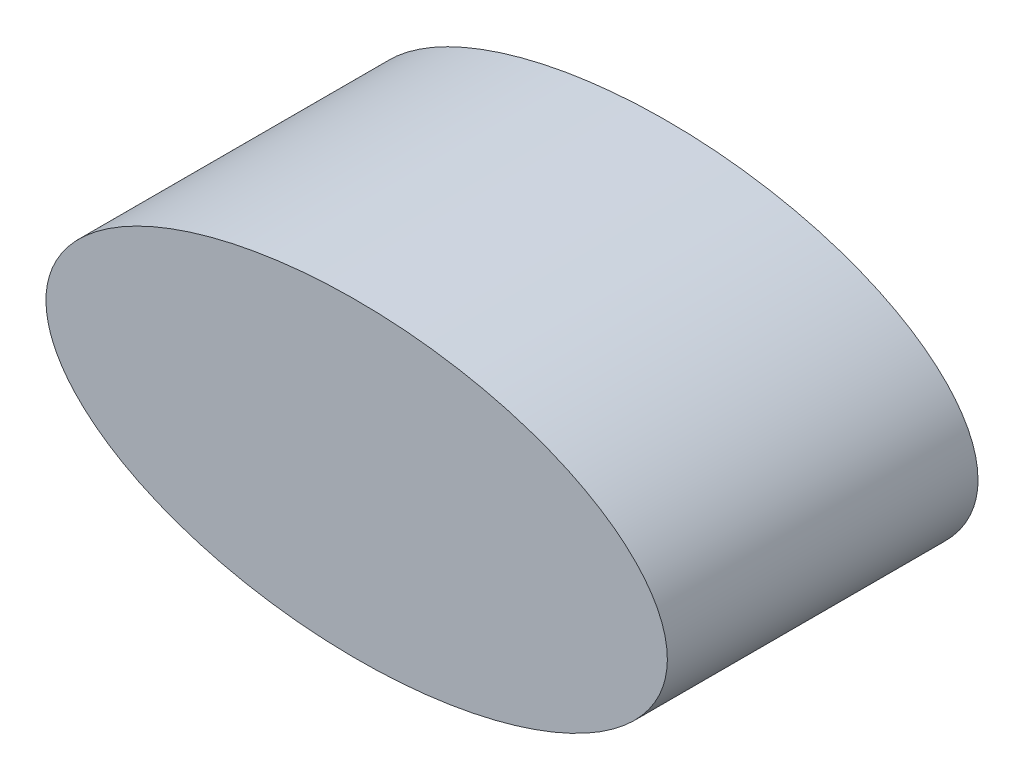
ISO-10303-21;
HEADER;
FILE_DESCRIPTION(('STEP AP214'),'2;1');
FILE_NAME('part.step','',(''),(''),'','','');
FILE_SCHEMA(('AUTOMOTIVE_DESIGN { 1 0 10303 214 1 1 1 1 }'));
ENDSEC;
DATA;
#1=APPLICATION_CONTEXT('core data for automotive mechanical design processes');
#2=APPLICATION_PROTOCOL_DEFINITION('international standard','automotive_design',2000,#1);
#3=PRODUCT_CONTEXT('',#1,'mechanical');
#4=PRODUCT('Part','Part','',(#3));
#5=PRODUCT_RELATED_PRODUCT_CATEGORY('part','',(#4));
#6=PRODUCT_DEFINITION_FORMATION('','',#4);
#7=PRODUCT_DEFINITION_CONTEXT('part definition',#1,'design');
#8=PRODUCT_DEFINITION('design','',#6,#7);
#9=PRODUCT_DEFINITION_SHAPE('','',#8);
#10=(LENGTH_UNIT() NAMED_UNIT(*) SI_UNIT(.MILLI.,.METRE.));
#11=(NAMED_UNIT(*) PLANE_ANGLE_UNIT() SI_UNIT($,.RADIAN.));
#12=(NAMED_UNIT(*) SI_UNIT($,.STERADIAN.) SOLID_ANGLE_UNIT());
#13=UNCERTAINTY_MEASURE_WITH_UNIT(LENGTH_MEASURE(1.E-05),#10,'distance_accuracy_value','');
#14=(GEOMETRIC_REPRESENTATION_CONTEXT(3) GLOBAL_UNCERTAINTY_ASSIGNED_CONTEXT((#13)) GLOBAL_UNIT_ASSIGNED_CONTEXT((#10,
#11,#12)) REPRESENTATION_CONTEXT('',''));
#15=CARTESIAN_POINT('',(0.,0.,0.));
#16=DIRECTION('',(0.,0.,1.));
#17=DIRECTION('',(1.,0.,0.));
#18=AXIS2_PLACEMENT_3D('',#15,#16,#17);
#19=CARTESIAN_POINT('',(20.,15.,5.));
#20=DIRECTION('',(0.,0.,1.));
#21=DIRECTION('',(1.,0.,0.));
#22=AXIS2_PLACEMENT_3D('',#19,#20,#21);
#23=ELLIPSE('',#22,5.,2.5);
#24=DIRECTION('',(0.,0.,-1.));
#25=VECTOR('',#24,1.);
#26=SURFACE_OF_LINEAR_EXTRUSION('',#23,#25);
#27=CARTESIAN_POINT('',(25.,15.,5.));
#28=VERTEX_POINT('',#27);
#29=EDGE_CURVE('E10',#28,#28,#23,.T.);
#30=ORIENTED_EDGE('',*,*,#29,.F.);
#31=EDGE_LOOP('',(#30));
#32=FACE_BOUND('',#31,.T.);
#33=CARTESIAN_POINT('',(20.,15.,0.));
#34=DIRECTION('',(0.,0.,1.));
#35=DIRECTION('',(1.,0.,0.));
#36=AXIS2_PLACEMENT_3D('',#33,#34,#35);
#37=ELLIPSE('',#36,5.,2.5);
#38=CARTESIAN_POINT('',(25.,15.,0.));
#39=VERTEX_POINT('',#38);
#40=EDGE_CURVE('E35',#39,#39,#37,.T.);
#41=ORIENTED_EDGE('',*,*,#40,.T.);
#42=EDGE_LOOP('',(#41));
#43=FACE_BOUND('',#42,.T.);
#44=ADVANCED_FACE('F31',(#32,#43),#26,.F.);
#45=CARTESIAN_POINT('',(20.,15.,5.));
#46=DIRECTION('',(0.,0.,1.));
#47=DIRECTION('',(1.,0.,0.));
#48=AXIS2_PLACEMENT_3D('',#45,#46,#47);
#49=PLANE('',#48);
#50=ORIENTED_EDGE('',*,*,#29,.T.);
#51=EDGE_LOOP('',(#50));
#52=FACE_BOUND('',#51,.T.);
#53=ADVANCED_FACE('F47',(#52),#49,.T.);
#54=CARTESIAN_POINT('',(20.,15.,0.));
#55=DIRECTION('',(0.,0.,1.));
#56=DIRECTION('',(1.,0.,0.));
#57=AXIS2_PLACEMENT_3D('',#54,#55,#56);
#58=PLANE('',#57);
#59=ORIENTED_EDGE('',*,*,#40,.F.);
#60=EDGE_LOOP('',(#59));
#61=FACE_BOUND('',#60,.T.);
#62=ADVANCED_FACE('F45',(#61),#58,.F.);
#63=CLOSED_SHELL('',(#44,#53,#62));
#64=MANIFOLD_SOLID_BREP('B2',#63);
#65=ADVANCED_BREP_SHAPE_REPRESENTATION('',(#18,#64),#14);
#66=SHAPE_DEFINITION_REPRESENTATION(#9,#65);
ENDSEC;
END-ISO-10303-21;
